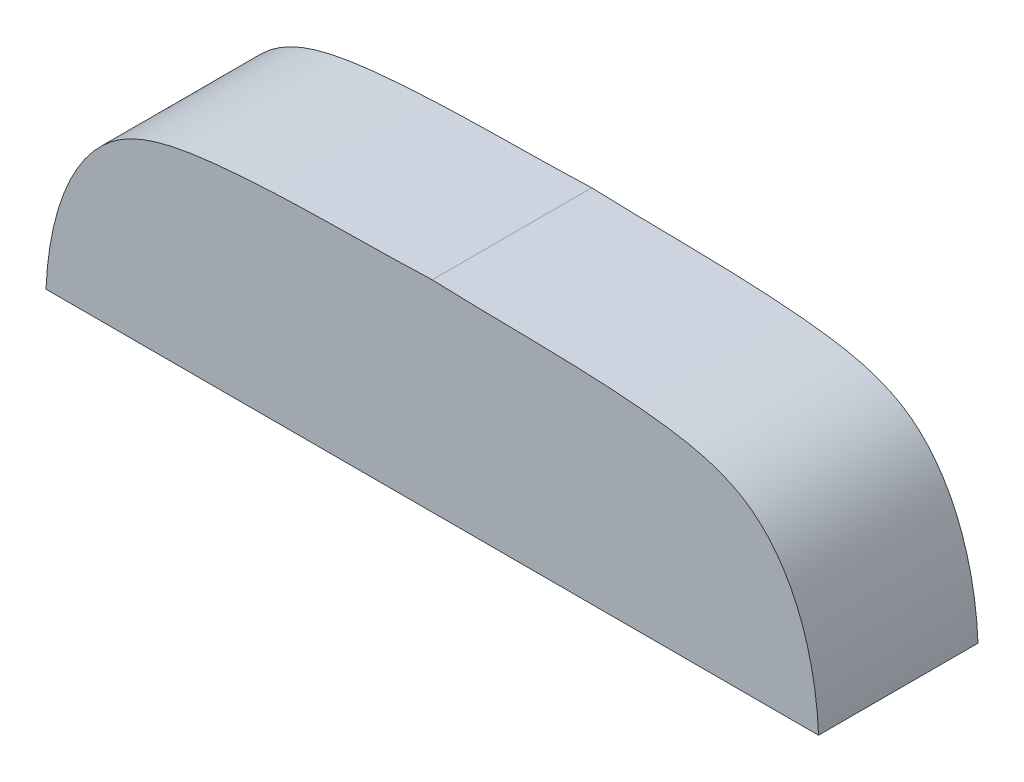
ISO-10303-21;
HEADER;
FILE_DESCRIPTION(('STEP AP214'),'2;1');
FILE_NAME('part.step','',(''),(''),'','','');
FILE_SCHEMA(('AUTOMOTIVE_DESIGN { 1 0 10303 214 1 1 1 1 }'));
ENDSEC;
DATA;
#1=APPLICATION_CONTEXT('core data for automotive mechanical design processes');
#2=APPLICATION_PROTOCOL_DEFINITION('international standard','automotive_design',2000,#1);
#3=PRODUCT_CONTEXT('',#1,'mechanical');
#4=PRODUCT('Part','Part','',(#3));
#5=PRODUCT_RELATED_PRODUCT_CATEGORY('part','',(#4));
#6=PRODUCT_DEFINITION_FORMATION('','',#4);
#7=PRODUCT_DEFINITION_CONTEXT('part definition',#1,'design');
#8=PRODUCT_DEFINITION('design','',#6,#7);
#9=PRODUCT_DEFINITION_SHAPE('','',#8);
#10=(LENGTH_UNIT() NAMED_UNIT(*) SI_UNIT(.MILLI.,.METRE.));
#11=(NAMED_UNIT(*) PLANE_ANGLE_UNIT() SI_UNIT($,.RADIAN.));
#12=(NAMED_UNIT(*) SI_UNIT($,.STERADIAN.) SOLID_ANGLE_UNIT());
#13=UNCERTAINTY_MEASURE_WITH_UNIT(LENGTH_MEASURE(1.E-05),#10,'distance_accuracy_value','');
#14=(GEOMETRIC_REPRESENTATION_CONTEXT(3) GLOBAL_UNCERTAINTY_ASSIGNED_CONTEXT((#13)) GLOBAL_UNIT_ASSIGNED_CONTEXT((#10,
#11,#12)) REPRESENTATION_CONTEXT('',''));
#15=CARTESIAN_POINT('',(0.,0.,0.));
#16=DIRECTION('',(0.,0.,1.));
#17=DIRECTION('',(1.,0.,0.));
#18=AXIS2_PLACEMENT_3D('',#15,#16,#17);
#19=CARTESIAN_POINT('',(0.,232.258315542862,-69.85));
#20=CARTESIAN_POINT('',(-56.542000296752,229.741128639672,-69.85));
#21=CARTESIAN_POINT('',(-174.485235663363,232.874469349727,-69.85));
#22=CARTESIAN_POINT('',(-302.766948323972,203.903921333154,-69.85));
#23=CARTESIAN_POINT('',(-335.826259434327,117.861475813508,-69.85));
#24=CARTESIAN_POINT('',(-338.420140941075,55.943822519318,-69.85));
#25=B_SPLINE_CURVE_WITH_KNOTS('',3,(#19,#20,#21,#22,#23,#24),.UNSPECIFIED.,.F.,.F.,(4,1,1,4),
(0.,0.225226498309052,0.337839747463577,0.524743477978156),.UNSPECIFIED.);
#26=DIRECTION('',(0.,0.,1.));
#27=VECTOR('',#26,1.);
#28=SURFACE_OF_LINEAR_EXTRUSION('',#25,#27);
#29=DIRECTION('',(0.,0.,1.));
#30=VECTOR('',#29,1.);
#31=CARTESIAN_POINT('',(-338.420140941075,55.9438225193181,-69.85));
#32=LINE('',#31,#30);
#33=CARTESIAN_POINT('',(-338.420140941075,55.9438225193181,-69.85));
#34=VERTEX_POINT('',#33);
#35=CARTESIAN_POINT('',(-338.420140941075,55.9438225193181,69.85));
#36=VERTEX_POINT('',#35);
#37=EDGE_CURVE('E43',#34,#36,#32,.T.);
#38=ORIENTED_EDGE('',*,*,#37,.T.);
#39=CARTESIAN_POINT('',(0.,232.258315542862,69.85));
#40=CARTESIAN_POINT('',(-56.542000296752,229.741128639672,69.85));
#41=CARTESIAN_POINT('',(-174.485235663363,232.874469349727,69.85));
#42=CARTESIAN_POINT('',(-302.766948323972,203.903921333154,69.85));
#43=CARTESIAN_POINT('',(-335.826259434327,117.861475813508,69.85));
#44=CARTESIAN_POINT('',(-338.420140941075,55.943822519318,69.85));
#45=B_SPLINE_CURVE_WITH_KNOTS('',3,(#39,#40,#41,#42,#43,#44),.UNSPECIFIED.,.F.,.F.,(4,1,1,4),
(0.,0.225226498309052,0.337839747463577,0.524743477978156),.UNSPECIFIED.);
#46=CARTESIAN_POINT('',(0.,232.258315542862,69.85));
#47=VERTEX_POINT('',#46);
#48=EDGE_CURVE('E74',#47,#36,#45,.T.);
#49=ORIENTED_EDGE('',*,*,#48,.F.);
#50=DIRECTION('',(0.,0.,1.));
#51=VECTOR('',#50,1.);
#52=CARTESIAN_POINT('',(0.,232.258315542862,-69.85));
#53=LINE('',#52,#51);
#54=CARTESIAN_POINT('',(0.,232.258315542862,-69.85));
#55=VERTEX_POINT('',#54);
#56=EDGE_CURVE('E11',#55,#47,#53,.T.);
#57=ORIENTED_EDGE('',*,*,#56,.F.);
#58=EDGE_CURVE('E75',#55,#34,#25,.T.);
#59=ORIENTED_EDGE('',*,*,#58,.T.);
#60=EDGE_LOOP('',(#38,#49,#57,#59));
#61=FACE_BOUND('',#60,.T.);
#62=ADVANCED_FACE('F39',(#61),#28,.T.);
#63=CARTESIAN_POINT('',(338.420140941075,55.9438225193181,-69.85));
#64=CARTESIAN_POINT('',(335.826259434327,117.861475813508,-69.85));
#65=CARTESIAN_POINT('',(302.766948323972,203.903921333154,-69.85));
#66=CARTESIAN_POINT('',(174.485235663363,232.874469349727,-69.85));
#67=CARTESIAN_POINT('',(56.5420002967519,229.741128639672,-69.85));
#68=CARTESIAN_POINT('',(0.,232.258315542862,-69.85));
#69=B_SPLINE_CURVE_WITH_KNOTS('',3,(#63,#64,#65,#66,#67,#68),.UNSPECIFIED.,.F.,.F.,(4,1,1,4),
(0.,0.186903730514579,0.299516979669105,0.524743477978156),.UNSPECIFIED.);
#70=DIRECTION('',(0.,0.,1.));
#71=VECTOR('',#70,1.);
#72=SURFACE_OF_LINEAR_EXTRUSION('',#69,#71);
#73=ORIENTED_EDGE('',*,*,#56,.T.);
#74=CARTESIAN_POINT('',(338.420140941075,55.9438225193181,69.85));
#75=CARTESIAN_POINT('',(335.826259434327,117.861475813508,69.85));
#76=CARTESIAN_POINT('',(302.766948323972,203.903921333154,69.85));
#77=CARTESIAN_POINT('',(174.485235663363,232.874469349727,69.85));
#78=CARTESIAN_POINT('',(56.5420002967519,229.741128639672,69.85));
#79=CARTESIAN_POINT('',(0.,232.258315542862,69.85));
#80=B_SPLINE_CURVE_WITH_KNOTS('',3,(#74,#75,#76,#77,#78,#79),.UNSPECIFIED.,.F.,.F.,(4,1,1,4),
(0.,0.186903730514579,0.299516979669105,0.524743477978156),.UNSPECIFIED.);
#81=CARTESIAN_POINT('',(338.420140941075,55.9438225193181,69.85));
#82=VERTEX_POINT('',#81);
#83=EDGE_CURVE('E83',#82,#47,#80,.T.);
#84=ORIENTED_EDGE('',*,*,#83,.F.);
#85=DIRECTION('',(0.,0.,1.));
#86=VECTOR('',#85,1.);
#87=CARTESIAN_POINT('',(338.420140941075,55.9438225193181,-69.85));
#88=LINE('',#87,#86);
#89=CARTESIAN_POINT('',(338.420140941075,55.9438225193181,-69.85));
#90=VERTEX_POINT('',#89);
#91=EDGE_CURVE('E48',#90,#82,#88,.T.);
#92=ORIENTED_EDGE('',*,*,#91,.F.);
#93=EDGE_CURVE('E76',#90,#55,#69,.T.);
#94=ORIENTED_EDGE('',*,*,#93,.T.);
#95=EDGE_LOOP('',(#73,#84,#92,#94));
#96=FACE_BOUND('',#95,.T.);
#97=ADVANCED_FACE('F114',(#96),#72,.T.);
#98=CARTESIAN_POINT('',(0.,55.9438225193181,-69.85));
#99=DIRECTION('',(0.,-1.,0.));
#100=DIRECTION('',(1.,0.,0.));
#101=AXIS2_PLACEMENT_3D('',#98,#99,#100);
#102=PLANE('',#101);
#103=ORIENTED_EDGE('',*,*,#91,.T.);
#104=DIRECTION('',(1.,0.,0.));
#105=VECTOR('',#104,1.);
#106=CARTESIAN_POINT('',(0.,55.9438225193181,69.85));
#107=LINE('',#106,#105);
#108=EDGE_CURVE('E78',#36,#82,#107,.T.);
#109=ORIENTED_EDGE('',*,*,#108,.F.);
#110=ORIENTED_EDGE('',*,*,#37,.F.);
#111=DIRECTION('',(1.,0.,0.));
#112=VECTOR('',#111,1.);
#113=CARTESIAN_POINT('',(0.,55.9438225193181,-69.85));
#114=LINE('',#113,#112);
#115=EDGE_CURVE('E62',#34,#90,#114,.T.);
#116=ORIENTED_EDGE('',*,*,#115,.T.);
#117=EDGE_LOOP('',(#103,#109,#110,#116));
#118=FACE_BOUND('',#117,.T.);
#119=ADVANCED_FACE('F79',(#118),#102,.T.);
#120=CARTESIAN_POINT('',(-227.87150871212,219.423826139862,-69.85));
#121=DIRECTION('',(0.,0.,1.));
#122=DIRECTION('',(1.,0.,0.));
#123=AXIS2_PLACEMENT_3D('',#120,#121,#122);
#124=PLANE('',#123);
#125=ORIENTED_EDGE('',*,*,#58,.F.);
#126=ORIENTED_EDGE('',*,*,#93,.F.);
#127=ORIENTED_EDGE('',*,*,#115,.F.);
#128=EDGE_LOOP('',(#125,#126,#127));
#129=FACE_BOUND('',#128,.T.);
#130=ADVANCED_FACE('F118',(#129),#124,.F.);
#131=CARTESIAN_POINT('',(-227.87150871212,219.423826139862,69.85));
#132=DIRECTION('',(0.,0.,1.));
#133=DIRECTION('',(1.,0.,0.));
#134=AXIS2_PLACEMENT_3D('',#131,#132,#133);
#135=PLANE('',#134);
#136=ORIENTED_EDGE('',*,*,#48,.T.);
#137=ORIENTED_EDGE('',*,*,#108,.T.);
#138=ORIENTED_EDGE('',*,*,#83,.T.);
#139=EDGE_LOOP('',(#136,#137,#138));
#140=FACE_BOUND('',#139,.T.);
#141=ADVANCED_FACE('F85',(#140),#135,.T.);
#142=CLOSED_SHELL('',(#62,#97,#119,#130,#141));
#143=MANIFOLD_SOLID_BREP('B2',#142);
#144=ADVANCED_BREP_SHAPE_REPRESENTATION('',(#18,#143),#14);
#145=SHAPE_DEFINITION_REPRESENTATION(#9,#144);
ENDSEC;
END-ISO-10303-21;
